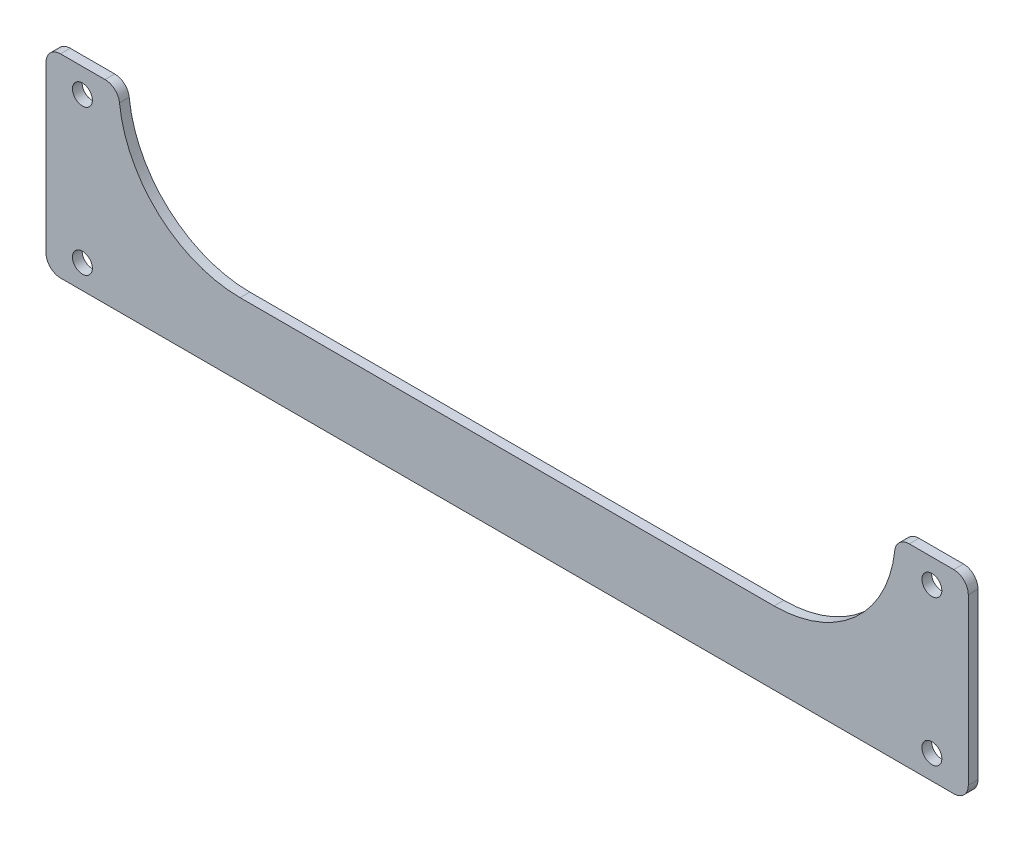
ISO-10303-21;
HEADER;
FILE_DESCRIPTION(('STEP AP214'),'2;1');
FILE_NAME('part.step','',(''),(''),'','','');
FILE_SCHEMA(('AUTOMOTIVE_DESIGN { 1 0 10303 214 1 1 1 1 }'));
ENDSEC;
DATA;
#1=APPLICATION_CONTEXT('core data for automotive mechanical design processes');
#2=APPLICATION_PROTOCOL_DEFINITION('international standard','automotive_design',2000,#1);
#3=PRODUCT_CONTEXT('',#1,'mechanical');
#4=PRODUCT('Part','Part','',(#3));
#5=PRODUCT_RELATED_PRODUCT_CATEGORY('part','',(#4));
#6=PRODUCT_DEFINITION_FORMATION('','',#4);
#7=PRODUCT_DEFINITION_CONTEXT('part definition',#1,'design');
#8=PRODUCT_DEFINITION('design','',#6,#7);
#9=PRODUCT_DEFINITION_SHAPE('','',#8);
#10=(LENGTH_UNIT() NAMED_UNIT(*) SI_UNIT(.MILLI.,.METRE.));
#11=(NAMED_UNIT(*) PLANE_ANGLE_UNIT() SI_UNIT($,.RADIAN.));
#12=(NAMED_UNIT(*) SI_UNIT($,.STERADIAN.) SOLID_ANGLE_UNIT());
#13=UNCERTAINTY_MEASURE_WITH_UNIT(LENGTH_MEASURE(1.E-05),#10,'distance_accuracy_value','');
#14=(GEOMETRIC_REPRESENTATION_CONTEXT(3) GLOBAL_UNCERTAINTY_ASSIGNED_CONTEXT((#13)) GLOBAL_UNIT_ASSIGNED_CONTEXT((#10,
#11,#12)) REPRESENTATION_CONTEXT('',''));
#15=CARTESIAN_POINT('',(0.,0.,0.));
#16=DIRECTION('',(0.,0.,1.));
#17=DIRECTION('',(1.,0.,0.));
#18=AXIS2_PLACEMENT_3D('',#15,#16,#17);
#19=CARTESIAN_POINT('',(-95.,20.,2.));
#20=DIRECTION('',(0.,-1.,0.));
#21=DIRECTION('',(0.,0.,-1.));
#22=AXIS2_PLACEMENT_3D('',#19,#20,#21);
#23=PLANE('',#22);
#24=DIRECTION('',(-1.,0.,0.));
#25=VECTOR('',#24,1.);
#26=CARTESIAN_POINT('',(-95.,20.,0.));
#27=LINE('',#26,#25);
#28=CARTESIAN_POINT('',(-82.8388218141501,20.,0.));
#29=VERTEX_POINT('',#28);
#30=CARTESIAN_POINT('',(-92.,20.,0.));
#31=VERTEX_POINT('',#30);
#32=EDGE_CURVE('E191',#29,#31,#27,.T.);
#33=ORIENTED_EDGE('',*,*,#32,.T.);
#34=DIRECTION('',(0.,0.,-1.));
#35=VECTOR('',#34,1.);
#36=CARTESIAN_POINT('',(-92.,20.,2.));
#37=LINE('',#36,#35);
#38=CARTESIAN_POINT('',(-92.,20.,2.));
#39=VERTEX_POINT('',#38);
#40=EDGE_CURVE('E41',#31,#39,#37,.F.);
#41=ORIENTED_EDGE('',*,*,#40,.T.);
#42=DIRECTION('',(-1.,0.,0.));
#43=VECTOR('',#42,1.);
#44=CARTESIAN_POINT('',(-95.,20.,2.));
#45=LINE('',#44,#43);
#46=CARTESIAN_POINT('',(-82.8388218141501,20.,2.));
#47=VERTEX_POINT('',#46);
#48=EDGE_CURVE('E177',#47,#39,#45,.T.);
#49=ORIENTED_EDGE('',*,*,#48,.F.);
#50=DIRECTION('',(0.,0.,-1.));
#51=VECTOR('',#50,1.);
#52=CARTESIAN_POINT('',(-82.8388218141501,20.,0.));
#53=LINE('',#52,#51);
#54=EDGE_CURVE('E55',#47,#29,#53,.T.);
#55=ORIENTED_EDGE('',*,*,#54,.T.);
#56=EDGE_LOOP('',(#33,#41,#49,#55));
#57=FACE_BOUND('',#56,.T.);
#58=ADVANCED_FACE('F33',(#57),#23,.F.);
#59=CARTESIAN_POINT('',(0.,0.,2.));
#60=DIRECTION('',(0.,0.,1.));
#61=DIRECTION('',(1.,0.,0.));
#62=AXIS2_PLACEMENT_3D('',#59,#60,#61);
#63=PLANE('',#62);
#64=CARTESIAN_POINT('',(-87.5,-15.,2.));
#65=DIRECTION('',(0.,0.,1.));
#66=DIRECTION('',(1.,0.,0.));
#67=AXIS2_PLACEMENT_3D('',#64,#65,#66);
#68=CIRCLE('',#67,2.04999999999999);
#69=CARTESIAN_POINT('',(-85.45,-15.,2.));
#70=VERTEX_POINT('',#69);
#71=EDGE_CURVE('E355',#70,#70,#68,.T.);
#72=ORIENTED_EDGE('',*,*,#71,.F.);
#73=EDGE_LOOP('',(#72));
#74=FACE_BOUND('',#73,.T.);
#75=CARTESIAN_POINT('',(87.5,-15.,2.));
#76=DIRECTION('',(0.,0.,1.));
#77=DIRECTION('',(-1.,0.,0.));
#78=AXIS2_PLACEMENT_3D('',#75,#76,#77);
#79=CIRCLE('',#78,2.04999999999999);
#80=CARTESIAN_POINT('',(85.45,-15.,2.));
#81=VERTEX_POINT('',#80);
#82=EDGE_CURVE('E351',#81,#81,#79,.T.);
#83=ORIENTED_EDGE('',*,*,#82,.F.);
#84=EDGE_LOOP('',(#83));
#85=FACE_BOUND('',#84,.T.);
#86=CARTESIAN_POINT('',(87.5,15.,2.));
#87=DIRECTION('',(0.,0.,1.));
#88=DIRECTION('',(-1.,0.,0.));
#89=AXIS2_PLACEMENT_3D('',#86,#87,#88);
#90=CIRCLE('',#89,2.04999999999999);
#91=CARTESIAN_POINT('',(85.45,15.,2.));
#92=VERTEX_POINT('',#91);
#93=EDGE_CURVE('E358',#92,#92,#90,.T.);
#94=ORIENTED_EDGE('',*,*,#93,.F.);
#95=EDGE_LOOP('',(#94));
#96=FACE_BOUND('',#95,.T.);
#97=CARTESIAN_POINT('',(-87.5,15.,2.));
#98=DIRECTION('',(0.,0.,1.));
#99=DIRECTION('',(1.,0.,0.));
#100=AXIS2_PLACEMENT_3D('',#97,#98,#99);
#101=CIRCLE('',#100,2.04999999999999);
#102=CARTESIAN_POINT('',(-85.45,15.,2.));
#103=VERTEX_POINT('',#102);
#104=EDGE_CURVE('E165',#103,#103,#101,.T.);
#105=ORIENTED_EDGE('',*,*,#104,.F.);
#106=EDGE_LOOP('',(#105));
#107=FACE_BOUND('',#106,.T.);
#108=CARTESIAN_POINT('',(92.,20.,2.));
#109=VERTEX_POINT('',#108);
#110=CARTESIAN_POINT('',(82.8388218141501,20.,2.));
#111=VERTEX_POINT('',#110);
#112=EDGE_CURVE('E181',#109,#111,#45,.T.);
#113=ORIENTED_EDGE('',*,*,#112,.T.);
#114=CARTESIAN_POINT('',(82.8388218141501,17.,2.));
#115=DIRECTION('',(0.,0.,1.));
#116=DIRECTION('',(1.,0.,0.));
#117=AXIS2_PLACEMENT_3D('',#114,#115,#116);
#118=CIRCLE('',#117,3.);
#119=CARTESIAN_POINT('',(79.8560909054912,17.3214285714286,2.));
#120=VERTEX_POINT('',#119);
#121=EDGE_CURVE('E214',#111,#120,#118,.T.);
#122=ORIENTED_EDGE('',*,*,#121,.T.);
#123=CARTESIAN_POINT('',(55.,20.,2.));
#124=DIRECTION('',(0.,0.,1.));
#125=DIRECTION('',(1.,0.,0.));
#126=AXIS2_PLACEMENT_3D('',#123,#124,#125);
#127=CIRCLE('',#126,25.);
#128=CARTESIAN_POINT('',(55.,-4.99999999999999,2.));
#129=VERTEX_POINT('',#128);
#130=EDGE_CURVE('E162',#129,#120,#127,.T.);
#131=ORIENTED_EDGE('',*,*,#130,.F.);
#132=DIRECTION('',(-1.,0.,0.));
#133=VECTOR('',#132,1.);
#134=CARTESIAN_POINT('',(0.,-5.,2.));
#135=LINE('',#134,#133);
#136=CARTESIAN_POINT('',(-55.,-5.00000000000001,2.));
#137=VERTEX_POINT('',#136);
#138=EDGE_CURVE('E142',#129,#137,#135,.T.);
#139=ORIENTED_EDGE('',*,*,#138,.T.);
#140=CARTESIAN_POINT('',(-55.,20.,2.));
#141=DIRECTION('',(0.,0.,1.));
#142=DIRECTION('',(1.,0.,0.));
#143=AXIS2_PLACEMENT_3D('',#140,#141,#142);
#144=CIRCLE('',#143,25.);
#145=CARTESIAN_POINT('',(-79.8560909054912,17.3214285714286,2.));
#146=VERTEX_POINT('',#145);
#147=EDGE_CURVE('E159',#137,#146,#144,.F.);
#148=ORIENTED_EDGE('',*,*,#147,.T.);
#149=CARTESIAN_POINT('',(-82.8388218141501,17.,2.));
#150=DIRECTION('',(0.,0.,1.));
#151=DIRECTION('',(1.,0.,0.));
#152=AXIS2_PLACEMENT_3D('',#149,#150,#151);
#153=CIRCLE('',#152,3.);
#154=EDGE_CURVE('E206',#146,#47,#153,.T.);
#155=ORIENTED_EDGE('',*,*,#154,.T.);
#156=ORIENTED_EDGE('',*,*,#48,.T.);
#157=CARTESIAN_POINT('',(-92.,17.,2.));
#158=DIRECTION('',(0.,0.,1.));
#159=DIRECTION('',(1.,0.,0.));
#160=AXIS2_PLACEMENT_3D('',#157,#158,#159);
#161=CIRCLE('',#160,3.);
#162=CARTESIAN_POINT('',(-95.,17.,2.));
#163=VERTEX_POINT('',#162);
#164=EDGE_CURVE('E208',#39,#163,#161,.T.);
#165=ORIENTED_EDGE('',*,*,#164,.T.);
#166=DIRECTION('',(0.,-1.,0.));
#167=VECTOR('',#166,1.);
#168=CARTESIAN_POINT('',(-95.,20.,2.));
#169=LINE('',#168,#167);
#170=CARTESIAN_POINT('',(-95.,-17.,2.));
#171=VERTEX_POINT('',#170);
#172=EDGE_CURVE('E182',#163,#171,#169,.T.);
#173=ORIENTED_EDGE('',*,*,#172,.T.);
#174=CARTESIAN_POINT('',(-92.,-17.,2.));
#175=DIRECTION('',(0.,0.,1.));
#176=DIRECTION('',(1.,0.,0.));
#177=AXIS2_PLACEMENT_3D('',#174,#175,#176);
#178=CIRCLE('',#177,3.);
#179=CARTESIAN_POINT('',(-92.,-20.,2.));
#180=VERTEX_POINT('',#179);
#181=EDGE_CURVE('E210',#171,#180,#178,.T.);
#182=ORIENTED_EDGE('',*,*,#181,.T.);
#183=DIRECTION('',(1.,0.,0.));
#184=VECTOR('',#183,1.);
#185=CARTESIAN_POINT('',(-95.,-20.,2.));
#186=LINE('',#185,#184);
#187=CARTESIAN_POINT('',(92.,-20.,2.));
#188=VERTEX_POINT('',#187);
#189=EDGE_CURVE('E185',#180,#188,#186,.T.);
#190=ORIENTED_EDGE('',*,*,#189,.T.);
#191=CARTESIAN_POINT('',(92.,-17.,2.));
#192=DIRECTION('',(0.,0.,1.));
#193=DIRECTION('',(1.,0.,0.));
#194=AXIS2_PLACEMENT_3D('',#191,#192,#193);
#195=CIRCLE('',#194,3.);
#196=CARTESIAN_POINT('',(95.,-17.,2.));
#197=VERTEX_POINT('',#196);
#198=EDGE_CURVE('E212',#188,#197,#195,.T.);
#199=ORIENTED_EDGE('',*,*,#198,.T.);
#200=DIRECTION('',(0.,1.,0.));
#201=VECTOR('',#200,1.);
#202=CARTESIAN_POINT('',(95.,20.,2.));
#203=LINE('',#202,#201);
#204=CARTESIAN_POINT('',(95.,17.,2.));
#205=VERTEX_POINT('',#204);
#206=EDGE_CURVE('E174',#197,#205,#203,.T.);
#207=ORIENTED_EDGE('',*,*,#206,.T.);
#208=CARTESIAN_POINT('',(92.,17.,2.));
#209=DIRECTION('',(0.,0.,1.));
#210=DIRECTION('',(1.,0.,0.));
#211=AXIS2_PLACEMENT_3D('',#208,#209,#210);
#212=CIRCLE('',#211,3.);
#213=EDGE_CURVE('E204',#205,#109,#212,.T.);
#214=ORIENTED_EDGE('',*,*,#213,.T.);
#215=EDGE_LOOP('',(#113,#122,#131,#139,#148,#155,#156,#165,#173,#182,#190,#199,#207,#214));
#216=FACE_BOUND('',#215,.T.);
#217=ADVANCED_FACE('F248',(#74,#85,#96,#107,#216),#63,.T.);
#218=CARTESIAN_POINT('',(0.,0.,0.));
#219=DIRECTION('',(0.,0.,1.));
#220=DIRECTION('',(1.,0.,0.));
#221=AXIS2_PLACEMENT_3D('',#218,#219,#220);
#222=PLANE('',#221);
#223=CARTESIAN_POINT('',(-87.5,-15.,0.));
#224=DIRECTION('',(0.,0.,1.));
#225=DIRECTION('',(1.,0.,0.));
#226=AXIS2_PLACEMENT_3D('',#223,#224,#225);
#227=CIRCLE('',#226,2.04999999999999);
#228=CARTESIAN_POINT('',(-85.45,-15.,0.));
#229=VERTEX_POINT('',#228);
#230=EDGE_CURVE('E367',#229,#229,#227,.T.);
#231=ORIENTED_EDGE('',*,*,#230,.T.);
#232=EDGE_LOOP('',(#231));
#233=FACE_BOUND('',#232,.T.);
#234=CARTESIAN_POINT('',(87.5,-15.,0.));
#235=DIRECTION('',(0.,0.,1.));
#236=DIRECTION('',(-1.,0.,0.));
#237=AXIS2_PLACEMENT_3D('',#234,#235,#236);
#238=CIRCLE('',#237,2.04999999999999);
#239=CARTESIAN_POINT('',(85.45,-15.,0.));
#240=VERTEX_POINT('',#239);
#241=EDGE_CURVE('E348',#240,#240,#238,.T.);
#242=ORIENTED_EDGE('',*,*,#241,.T.);
#243=EDGE_LOOP('',(#242));
#244=FACE_BOUND('',#243,.T.);
#245=CARTESIAN_POINT('',(87.5,15.,0.));
#246=DIRECTION('',(0.,0.,1.));
#247=DIRECTION('',(-1.,0.,0.));
#248=AXIS2_PLACEMENT_3D('',#245,#246,#247);
#249=CIRCLE('',#248,2.04999999999999);
#250=CARTESIAN_POINT('',(85.45,15.,0.));
#251=VERTEX_POINT('',#250);
#252=EDGE_CURVE('E353',#251,#251,#249,.T.);
#253=ORIENTED_EDGE('',*,*,#252,.T.);
#254=EDGE_LOOP('',(#253));
#255=FACE_BOUND('',#254,.T.);
#256=CARTESIAN_POINT('',(-87.5,15.,0.));
#257=DIRECTION('',(0.,0.,1.));
#258=DIRECTION('',(1.,0.,0.));
#259=AXIS2_PLACEMENT_3D('',#256,#257,#258);
#260=CIRCLE('',#259,2.04999999999999);
#261=CARTESIAN_POINT('',(-85.45,15.,0.));
#262=VERTEX_POINT('',#261);
#263=EDGE_CURVE('E170',#262,#262,#260,.T.);
#264=ORIENTED_EDGE('',*,*,#263,.T.);
#265=EDGE_LOOP('',(#264));
#266=FACE_BOUND('',#265,.T.);
#267=CARTESIAN_POINT('',(55.,20.,0.));
#268=DIRECTION('',(0.,0.,1.));
#269=DIRECTION('',(1.,0.,0.));
#270=AXIS2_PLACEMENT_3D('',#267,#268,#269);
#271=CIRCLE('',#270,25.);
#272=CARTESIAN_POINT('',(55.,-4.99999999999999,0.));
#273=VERTEX_POINT('',#272);
#274=CARTESIAN_POINT('',(79.8560909054912,17.3214285714286,0.));
#275=VERTEX_POINT('',#274);
#276=EDGE_CURVE('E150',#273,#275,#271,.T.);
#277=ORIENTED_EDGE('',*,*,#276,.T.);
#278=CARTESIAN_POINT('',(82.8388218141501,17.,0.));
#279=DIRECTION('',(0.,0.,1.));
#280=DIRECTION('',(1.,0.,0.));
#281=AXIS2_PLACEMENT_3D('',#278,#279,#280);
#282=CIRCLE('',#281,3.);
#283=CARTESIAN_POINT('',(82.8388218141501,20.,0.));
#284=VERTEX_POINT('',#283);
#285=EDGE_CURVE('E226',#275,#284,#282,.F.);
#286=ORIENTED_EDGE('',*,*,#285,.T.);
#287=CARTESIAN_POINT('',(92.,20.,0.));
#288=VERTEX_POINT('',#287);
#289=EDGE_CURVE('E193',#288,#284,#27,.T.);
#290=ORIENTED_EDGE('',*,*,#289,.F.);
#291=CARTESIAN_POINT('',(92.,17.,0.));
#292=DIRECTION('',(0.,0.,1.));
#293=DIRECTION('',(1.,0.,0.));
#294=AXIS2_PLACEMENT_3D('',#291,#292,#293);
#295=CIRCLE('',#294,3.);
#296=CARTESIAN_POINT('',(95.,17.,0.));
#297=VERTEX_POINT('',#296);
#298=EDGE_CURVE('E217',#288,#297,#295,.F.);
#299=ORIENTED_EDGE('',*,*,#298,.T.);
#300=DIRECTION('',(0.,1.,0.));
#301=VECTOR('',#300,1.);
#302=CARTESIAN_POINT('',(95.,20.,0.));
#303=LINE('',#302,#301);
#304=CARTESIAN_POINT('',(95.,-17.,0.));
#305=VERTEX_POINT('',#304);
#306=EDGE_CURVE('E172',#305,#297,#303,.T.);
#307=ORIENTED_EDGE('',*,*,#306,.F.);
#308=CARTESIAN_POINT('',(92.,-17.,0.));
#309=DIRECTION('',(0.,0.,1.));
#310=DIRECTION('',(1.,0.,0.));
#311=AXIS2_PLACEMENT_3D('',#308,#309,#310);
#312=CIRCLE('',#311,3.);
#313=CARTESIAN_POINT('',(92.,-20.,0.));
#314=VERTEX_POINT('',#313);
#315=EDGE_CURVE('E224',#305,#314,#312,.F.);
#316=ORIENTED_EDGE('',*,*,#315,.T.);
#317=DIRECTION('',(1.,0.,0.));
#318=VECTOR('',#317,1.);
#319=CARTESIAN_POINT('',(-95.,-20.,0.));
#320=LINE('',#319,#318);
#321=CARTESIAN_POINT('',(-92.,-20.,0.));
#322=VERTEX_POINT('',#321);
#323=EDGE_CURVE('E178',#322,#314,#320,.T.);
#324=ORIENTED_EDGE('',*,*,#323,.F.);
#325=CARTESIAN_POINT('',(-92.,-17.,0.));
#326=DIRECTION('',(0.,0.,1.));
#327=DIRECTION('',(1.,0.,0.));
#328=AXIS2_PLACEMENT_3D('',#325,#326,#327);
#329=CIRCLE('',#328,3.);
#330=CARTESIAN_POINT('',(-95.,-17.,0.));
#331=VERTEX_POINT('',#330);
#332=EDGE_CURVE('E222',#322,#331,#329,.F.);
#333=ORIENTED_EDGE('',*,*,#332,.T.);
#334=DIRECTION('',(0.,-1.,0.));
#335=VECTOR('',#334,1.);
#336=CARTESIAN_POINT('',(-95.,20.,0.));
#337=LINE('',#336,#335);
#338=CARTESIAN_POINT('',(-95.,17.,0.));
#339=VERTEX_POINT('',#338);
#340=EDGE_CURVE('E194',#339,#331,#337,.T.);
#341=ORIENTED_EDGE('',*,*,#340,.F.);
#342=CARTESIAN_POINT('',(-92.,17.,0.));
#343=DIRECTION('',(0.,0.,1.));
#344=DIRECTION('',(1.,0.,0.));
#345=AXIS2_PLACEMENT_3D('',#342,#343,#344);
#346=CIRCLE('',#345,3.);
#347=EDGE_CURVE('E48',#339,#31,#346,.F.);
#348=ORIENTED_EDGE('',*,*,#347,.T.);
#349=ORIENTED_EDGE('',*,*,#32,.F.);
#350=CARTESIAN_POINT('',(-82.8388218141501,17.,0.));
#351=DIRECTION('',(0.,0.,1.));
#352=DIRECTION('',(1.,0.,0.));
#353=AXIS2_PLACEMENT_3D('',#350,#351,#352);
#354=CIRCLE('',#353,3.);
#355=CARTESIAN_POINT('',(-79.8560909054912,17.3214285714286,0.));
#356=VERTEX_POINT('',#355);
#357=EDGE_CURVE('E219',#29,#356,#354,.F.);
#358=ORIENTED_EDGE('',*,*,#357,.T.);
#359=CARTESIAN_POINT('',(-55.,20.,0.));
#360=DIRECTION('',(0.,0.,1.));
#361=DIRECTION('',(1.,0.,0.));
#362=AXIS2_PLACEMENT_3D('',#359,#360,#361);
#363=CIRCLE('',#362,25.);
#364=CARTESIAN_POINT('',(-55.,-5.00000000000001,0.));
#365=VERTEX_POINT('',#364);
#366=EDGE_CURVE('E147',#365,#356,#363,.F.);
#367=ORIENTED_EDGE('',*,*,#366,.F.);
#368=DIRECTION('',(-1.,0.,0.));
#369=VECTOR('',#368,1.);
#370=CARTESIAN_POINT('',(0.,-5.,0.));
#371=LINE('',#370,#369);
#372=EDGE_CURVE('E139',#273,#365,#371,.T.);
#373=ORIENTED_EDGE('',*,*,#372,.F.);
#374=EDGE_LOOP('',(#277,#286,#290,#299,#307,#316,#324,#333,#341,#348,#349,#358,#367,#373));
#375=FACE_BOUND('',#374,.T.);
#376=ADVANCED_FACE('F157',(#233,#244,#255,#266,#375),#222,.F.);
#377=CARTESIAN_POINT('',(95.,20.,2.));
#378=DIRECTION('',(-1.,0.,0.));
#379=DIRECTION('',(0.,0.,1.));
#380=AXIS2_PLACEMENT_3D('',#377,#378,#379);
#381=PLANE('',#380);
#382=ORIENTED_EDGE('',*,*,#206,.F.);
#383=DIRECTION('',(0.,0.,-1.));
#384=VECTOR('',#383,1.);
#385=CARTESIAN_POINT('',(95.,-17.,2.));
#386=LINE('',#385,#384);
#387=EDGE_CURVE('E230',#197,#305,#386,.T.);
#388=ORIENTED_EDGE('',*,*,#387,.T.);
#389=ORIENTED_EDGE('',*,*,#306,.T.);
#390=DIRECTION('',(0.,0.,-1.));
#391=VECTOR('',#390,1.);
#392=CARTESIAN_POINT('',(95.,17.,2.));
#393=LINE('',#392,#391);
#394=EDGE_CURVE('E228',#297,#205,#393,.F.);
#395=ORIENTED_EDGE('',*,*,#394,.T.);
#396=EDGE_LOOP('',(#382,#388,#389,#395));
#397=FACE_BOUND('',#396,.T.);
#398=ADVANCED_FACE('F271',(#397),#381,.F.);
#399=ORIENTED_EDGE('',*,*,#289,.T.);
#400=DIRECTION('',(0.,0.,1.));
#401=VECTOR('',#400,1.);
#402=CARTESIAN_POINT('',(82.8388218141501,20.,2.));
#403=LINE('',#402,#401);
#404=EDGE_CURVE('E201',#284,#111,#403,.T.);
#405=ORIENTED_EDGE('',*,*,#404,.T.);
#406=ORIENTED_EDGE('',*,*,#112,.F.);
#407=DIRECTION('',(0.,0.,-1.));
#408=VECTOR('',#407,1.);
#409=CARTESIAN_POINT('',(92.,20.,2.));
#410=LINE('',#409,#408);
#411=EDGE_CURVE('E188',#109,#288,#410,.T.);
#412=ORIENTED_EDGE('',*,*,#411,.T.);
#413=EDGE_LOOP('',(#399,#405,#406,#412));
#414=FACE_BOUND('',#413,.T.);
#415=ADVANCED_FACE('F280',(#414),#23,.F.);
#416=CARTESIAN_POINT('',(-95.,20.,2.));
#417=DIRECTION('',(1.,0.,0.));
#418=DIRECTION('',(0.,0.,-1.));
#419=AXIS2_PLACEMENT_3D('',#416,#417,#418);
#420=PLANE('',#419);
#421=ORIENTED_EDGE('',*,*,#340,.T.);
#422=DIRECTION('',(0.,0.,-1.));
#423=VECTOR('',#422,1.);
#424=CARTESIAN_POINT('',(-95.,-17.,2.));
#425=LINE('',#424,#423);
#426=EDGE_CURVE('E241',#331,#171,#425,.F.);
#427=ORIENTED_EDGE('',*,*,#426,.T.);
#428=ORIENTED_EDGE('',*,*,#172,.F.);
#429=DIRECTION('',(0.,0.,-1.));
#430=VECTOR('',#429,1.);
#431=CARTESIAN_POINT('',(-95.,17.,2.));
#432=LINE('',#431,#430);
#433=EDGE_CURVE('E238',#163,#339,#432,.T.);
#434=ORIENTED_EDGE('',*,*,#433,.T.);
#435=EDGE_LOOP('',(#421,#427,#428,#434));
#436=FACE_BOUND('',#435,.T.);
#437=ADVANCED_FACE('F253',(#436),#420,.F.);
#438=CARTESIAN_POINT('',(-95.,-20.,2.));
#439=DIRECTION('',(0.,1.,0.));
#440=DIRECTION('',(0.,0.,1.));
#441=AXIS2_PLACEMENT_3D('',#438,#439,#440);
#442=PLANE('',#441);
#443=ORIENTED_EDGE('',*,*,#323,.T.);
#444=DIRECTION('',(0.,0.,-1.));
#445=VECTOR('',#444,1.);
#446=CARTESIAN_POINT('',(92.,-20.,2.));
#447=LINE('',#446,#445);
#448=EDGE_CURVE('E236',#314,#188,#447,.F.);
#449=ORIENTED_EDGE('',*,*,#448,.T.);
#450=ORIENTED_EDGE('',*,*,#189,.F.);
#451=DIRECTION('',(0.,0.,-1.));
#452=VECTOR('',#451,1.);
#453=CARTESIAN_POINT('',(-92.,-20.,2.));
#454=LINE('',#453,#452);
#455=EDGE_CURVE('E233',#180,#322,#454,.T.);
#456=ORIENTED_EDGE('',*,*,#455,.T.);
#457=EDGE_LOOP('',(#443,#449,#450,#456));
#458=FACE_BOUND('',#457,.T.);
#459=ADVANCED_FACE('F262',(#458),#442,.F.);
#460=CARTESIAN_POINT('',(0.,-5.,0.));
#461=DIRECTION('',(0.,1.,0.));
#462=DIRECTION('',(-1.,0.,0.));
#463=AXIS2_PLACEMENT_3D('',#460,#461,#462);
#464=PLANE('',#463);
#465=ORIENTED_EDGE('',*,*,#138,.F.);
#466=DIRECTION('',(0.,0.,1.));
#467=VECTOR('',#466,1.);
#468=CARTESIAN_POINT('',(55.,-4.99999999999999,0.));
#469=LINE('',#468,#467);
#470=EDGE_CURVE('E134',#273,#129,#469,.T.);
#471=ORIENTED_EDGE('',*,*,#470,.F.);
#472=ORIENTED_EDGE('',*,*,#372,.T.);
#473=DIRECTION('',(0.,0.,1.));
#474=VECTOR('',#473,1.);
#475=CARTESIAN_POINT('',(-55.,-5.00000000000001,0.));
#476=LINE('',#475,#474);
#477=EDGE_CURVE('E146',#365,#137,#476,.T.);
#478=ORIENTED_EDGE('',*,*,#477,.T.);
#479=EDGE_LOOP('',(#465,#471,#472,#478));
#480=FACE_BOUND('',#479,.T.);
#481=ADVANCED_FACE('F136',(#480),#464,.T.);
#482=CARTESIAN_POINT('',(-55.,20.,0.));
#483=DIRECTION('',(0.,0.,1.));
#484=DIRECTION('',(1.,0.,0.));
#485=AXIS2_PLACEMENT_3D('',#482,#483,#484);
#486=CYLINDRICAL_SURFACE('',#485,25.);
#487=ORIENTED_EDGE('',*,*,#366,.T.);
#488=DIRECTION('',(0.,0.,1.));
#489=VECTOR('',#488,1.);
#490=CARTESIAN_POINT('',(-79.8560909054912,17.3214285714286,0.));
#491=LINE('',#490,#489);
#492=EDGE_CURVE('E11',#356,#146,#491,.T.);
#493=ORIENTED_EDGE('',*,*,#492,.T.);
#494=ORIENTED_EDGE('',*,*,#147,.F.);
#495=ORIENTED_EDGE('',*,*,#477,.F.);
#496=EDGE_LOOP('',(#487,#493,#494,#495));
#497=FACE_BOUND('',#496,.T.);
#498=ADVANCED_FACE('F324',(#497),#486,.F.);
#499=CARTESIAN_POINT('',(55.,20.,0.));
#500=DIRECTION('',(0.,0.,1.));
#501=DIRECTION('',(1.,0.,0.));
#502=AXIS2_PLACEMENT_3D('',#499,#500,#501);
#503=CYLINDRICAL_SURFACE('',#502,25.);
#504=ORIENTED_EDGE('',*,*,#130,.T.);
#505=DIRECTION('',(0.,0.,1.));
#506=VECTOR('',#505,1.);
#507=CARTESIAN_POINT('',(79.8560909054912,17.3214285714286,0.));
#508=LINE('',#507,#506);
#509=EDGE_CURVE('E153',#120,#275,#508,.F.);
#510=ORIENTED_EDGE('',*,*,#509,.T.);
#511=ORIENTED_EDGE('',*,*,#276,.F.);
#512=ORIENTED_EDGE('',*,*,#470,.T.);
#513=EDGE_LOOP('',(#504,#510,#511,#512));
#514=FACE_BOUND('',#513,.T.);
#515=ADVANCED_FACE('F151',(#514),#503,.F.);
#516=CARTESIAN_POINT('',(-87.5,15.,0.));
#517=DIRECTION('',(0.,0.,1.));
#518=DIRECTION('',(1.,0.,0.));
#519=AXIS2_PLACEMENT_3D('',#516,#517,#518);
#520=CYLINDRICAL_SURFACE('',#519,2.04999999999999);
#521=ORIENTED_EDGE('',*,*,#263,.F.);
#522=EDGE_LOOP('',(#521));
#523=FACE_BOUND('',#522,.T.);
#524=ORIENTED_EDGE('',*,*,#104,.T.);
#525=EDGE_LOOP('',(#524));
#526=FACE_BOUND('',#525,.T.);
#527=ADVANCED_FACE('F332',(#523,#526),#520,.F.);
#528=CARTESIAN_POINT('',(87.5,15.,0.));
#529=DIRECTION('',(0.,0.,1.));
#530=DIRECTION('',(1.,0.,0.));
#531=AXIS2_PLACEMENT_3D('',#528,#529,#530);
#532=CYLINDRICAL_SURFACE('',#531,2.04999999999999);
#533=ORIENTED_EDGE('',*,*,#252,.F.);
#534=EDGE_LOOP('',(#533));
#535=FACE_BOUND('',#534,.T.);
#536=ORIENTED_EDGE('',*,*,#93,.T.);
#537=EDGE_LOOP('',(#536));
#538=FACE_BOUND('',#537,.T.);
#539=ADVANCED_FACE('F336',(#535,#538),#532,.F.);
#540=CARTESIAN_POINT('',(87.5,-15.,0.));
#541=DIRECTION('',(0.,0.,1.));
#542=DIRECTION('',(1.,0.,0.));
#543=AXIS2_PLACEMENT_3D('',#540,#541,#542);
#544=CYLINDRICAL_SURFACE('',#543,2.04999999999999);
#545=ORIENTED_EDGE('',*,*,#241,.F.);
#546=EDGE_LOOP('',(#545));
#547=FACE_BOUND('',#546,.T.);
#548=ORIENTED_EDGE('',*,*,#82,.T.);
#549=EDGE_LOOP('',(#548));
#550=FACE_BOUND('',#549,.T.);
#551=ADVANCED_FACE('F292',(#547,#550),#544,.F.);
#552=CARTESIAN_POINT('',(-87.5,-15.,0.));
#553=DIRECTION('',(0.,0.,1.));
#554=DIRECTION('',(1.,0.,0.));
#555=AXIS2_PLACEMENT_3D('',#552,#553,#554);
#556=CYLINDRICAL_SURFACE('',#555,2.04999999999999);
#557=ORIENTED_EDGE('',*,*,#230,.F.);
#558=EDGE_LOOP('',(#557));
#559=FACE_BOUND('',#558,.T.);
#560=ORIENTED_EDGE('',*,*,#71,.T.);
#561=EDGE_LOOP('',(#560));
#562=FACE_BOUND('',#561,.T.);
#563=ADVANCED_FACE('F285',(#559,#562),#556,.F.);
#564=CARTESIAN_POINT('',(82.8388218141501,17.,0.));
#565=DIRECTION('',(0.,0.,1.));
#566=DIRECTION('',(1.,0.,0.));
#567=AXIS2_PLACEMENT_3D('',#564,#565,#566);
#568=CYLINDRICAL_SURFACE('',#567,3.);
#569=ORIENTED_EDGE('',*,*,#285,.F.);
#570=ORIENTED_EDGE('',*,*,#509,.F.);
#571=ORIENTED_EDGE('',*,*,#121,.F.);
#572=ORIENTED_EDGE('',*,*,#404,.F.);
#573=EDGE_LOOP('',(#569,#570,#571,#572));
#574=FACE_BOUND('',#573,.T.);
#575=ADVANCED_FACE('F283',(#574),#568,.T.);
#576=CARTESIAN_POINT('',(92.,-17.,2.));
#577=DIRECTION('',(0.,0.,-1.));
#578=DIRECTION('',(-1.,0.,0.));
#579=AXIS2_PLACEMENT_3D('',#576,#577,#578);
#580=CYLINDRICAL_SURFACE('',#579,3.);
#581=ORIENTED_EDGE('',*,*,#198,.F.);
#582=ORIENTED_EDGE('',*,*,#448,.F.);
#583=ORIENTED_EDGE('',*,*,#315,.F.);
#584=ORIENTED_EDGE('',*,*,#387,.F.);
#585=EDGE_LOOP('',(#581,#582,#583,#584));
#586=FACE_BOUND('',#585,.T.);
#587=ADVANCED_FACE('F268',(#586),#580,.T.);
#588=CARTESIAN_POINT('',(-92.,-17.,2.));
#589=DIRECTION('',(0.,0.,-1.));
#590=DIRECTION('',(-1.,0.,0.));
#591=AXIS2_PLACEMENT_3D('',#588,#589,#590);
#592=CYLINDRICAL_SURFACE('',#591,3.);
#593=ORIENTED_EDGE('',*,*,#181,.F.);
#594=ORIENTED_EDGE('',*,*,#426,.F.);
#595=ORIENTED_EDGE('',*,*,#332,.F.);
#596=ORIENTED_EDGE('',*,*,#455,.F.);
#597=EDGE_LOOP('',(#593,#594,#595,#596));
#598=FACE_BOUND('',#597,.T.);
#599=ADVANCED_FACE('F259',(#598),#592,.T.);
#600=CARTESIAN_POINT('',(-92.,17.,2.));
#601=DIRECTION('',(0.,0.,-1.));
#602=DIRECTION('',(-1.,0.,0.));
#603=AXIS2_PLACEMENT_3D('',#600,#601,#602);
#604=CYLINDRICAL_SURFACE('',#603,3.);
#605=ORIENTED_EDGE('',*,*,#164,.F.);
#606=ORIENTED_EDGE('',*,*,#40,.F.);
#607=ORIENTED_EDGE('',*,*,#347,.F.);
#608=ORIENTED_EDGE('',*,*,#433,.F.);
#609=EDGE_LOOP('',(#605,#606,#607,#608));
#610=FACE_BOUND('',#609,.T.);
#611=ADVANCED_FACE('F251',(#610),#604,.T.);
#612=CARTESIAN_POINT('',(-82.8388218141501,17.,0.));
#613=DIRECTION('',(0.,0.,1.));
#614=DIRECTION('',(1.,0.,0.));
#615=AXIS2_PLACEMENT_3D('',#612,#613,#614);
#616=CYLINDRICAL_SURFACE('',#615,3.);
#617=ORIENTED_EDGE('',*,*,#357,.F.);
#618=ORIENTED_EDGE('',*,*,#54,.F.);
#619=ORIENTED_EDGE('',*,*,#154,.F.);
#620=ORIENTED_EDGE('',*,*,#492,.F.);
#621=EDGE_LOOP('',(#617,#618,#619,#620));
#622=FACE_BOUND('',#621,.T.);
#623=ADVANCED_FACE('F460',(#622),#616,.T.);
#624=CARTESIAN_POINT('',(92.,17.,2.));
#625=DIRECTION('',(0.,0.,-1.));
#626=DIRECTION('',(-1.,0.,0.));
#627=AXIS2_PLACEMENT_3D('',#624,#625,#626);
#628=CYLINDRICAL_SURFACE('',#627,3.);
#629=ORIENTED_EDGE('',*,*,#213,.F.);
#630=ORIENTED_EDGE('',*,*,#394,.F.);
#631=ORIENTED_EDGE('',*,*,#298,.F.);
#632=ORIENTED_EDGE('',*,*,#411,.F.);
#633=EDGE_LOOP('',(#629,#630,#631,#632));
#634=FACE_BOUND('',#633,.T.);
#635=ADVANCED_FACE('F35',(#634),#628,.T.);
#636=CLOSED_SHELL('',(#58,#217,#376,#398,#415,#437,#459,#481,#498,#515,#527,#539,#551,#563,#575,
#587,#599,#611,#623,#635));
#637=MANIFOLD_SOLID_BREP('B2',#636);
#638=ADVANCED_BREP_SHAPE_REPRESENTATION('',(#18,#637),#14);
#639=SHAPE_DEFINITION_REPRESENTATION(#9,#638);
ENDSEC;
END-ISO-10303-21;
